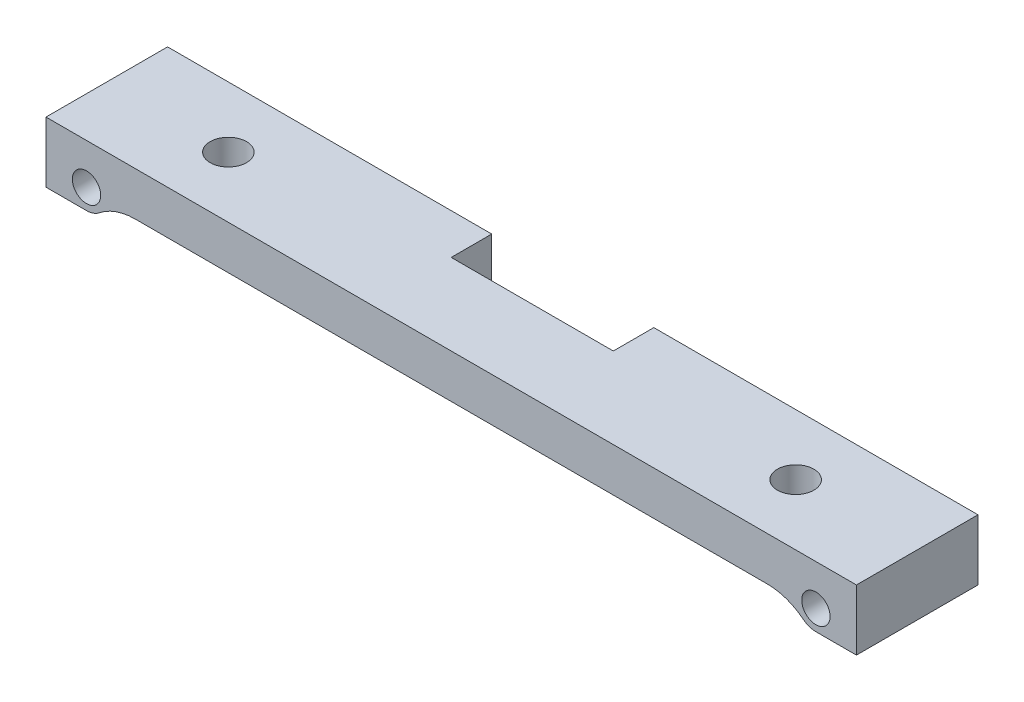
ISO-10303-21;
HEADER;
FILE_DESCRIPTION(('STEP AP214'),'2;1');
FILE_NAME('part.step','',(''),(''),'','','');
FILE_SCHEMA(('AUTOMOTIVE_DESIGN { 1 0 10303 214 1 1 1 1 }'));
ENDSEC;
DATA;
#1=APPLICATION_CONTEXT('core data for automotive mechanical design processes');
#2=APPLICATION_PROTOCOL_DEFINITION('international standard','automotive_design',2000,#1);
#3=PRODUCT_CONTEXT('',#1,'mechanical');
#4=PRODUCT('Part','Part','',(#3));
#5=PRODUCT_RELATED_PRODUCT_CATEGORY('part','',(#4));
#6=PRODUCT_DEFINITION_FORMATION('','',#4);
#7=PRODUCT_DEFINITION_CONTEXT('part definition',#1,'design');
#8=PRODUCT_DEFINITION('design','',#6,#7);
#9=PRODUCT_DEFINITION_SHAPE('','',#8);
#10=(LENGTH_UNIT() NAMED_UNIT(*) SI_UNIT(.MILLI.,.METRE.));
#11=(NAMED_UNIT(*) PLANE_ANGLE_UNIT() SI_UNIT($,.RADIAN.));
#12=(NAMED_UNIT(*) SI_UNIT($,.STERADIAN.) SOLID_ANGLE_UNIT());
#13=UNCERTAINTY_MEASURE_WITH_UNIT(LENGTH_MEASURE(1.E-05),#10,'distance_accuracy_value','');
#14=(GEOMETRIC_REPRESENTATION_CONTEXT(3) GLOBAL_UNCERTAINTY_ASSIGNED_CONTEXT((#13)) GLOBAL_UNIT_ASSIGNED_CONTEXT((#10,
#11,#12)) REPRESENTATION_CONTEXT('',''));
#15=CARTESIAN_POINT('',(0.,0.,0.));
#16=DIRECTION('',(0.,0.,1.));
#17=DIRECTION('',(1.,0.,0.));
#18=AXIS2_PLACEMENT_3D('',#15,#16,#17);
#19=CARTESIAN_POINT('',(45.,60.,0.));
#20=DIRECTION('',(0.,0.,-1.));
#21=DIRECTION('',(-1.,0.,0.));
#22=AXIS2_PLACEMENT_3D('',#19,#20,#21);
#23=PLANE('',#22);
#24=DIRECTION('',(0.,1.,0.));
#25=VECTOR('',#24,1.);
#26=CARTESIAN_POINT('',(10.,50.,0.));
#27=LINE('',#26,#25);
#28=CARTESIAN_POINT('',(10.,59.6046863561493,0.));
#29=VERTEX_POINT('',#28);
#30=CARTESIAN_POINT('',(10.,65.,0.));
#31=VERTEX_POINT('',#30);
#32=EDGE_CURVE('E245',#29,#31,#27,.T.);
#33=ORIENTED_EDGE('',*,*,#32,.T.);
#34=DIRECTION('',(-1.,0.,0.));
#35=VECTOR('',#34,1.);
#36=CARTESIAN_POINT('',(50.,65.,0.));
#37=LINE('',#36,#35);
#38=CARTESIAN_POINT('',(50.,65.,0.));
#39=VERTEX_POINT('',#38);
#40=EDGE_CURVE('E180',#39,#31,#37,.T.);
#41=ORIENTED_EDGE('',*,*,#40,.F.);
#42=DIRECTION('',(0.,1.,0.));
#43=VECTOR('',#42,1.);
#44=CARTESIAN_POINT('',(50.,57.5,0.));
#45=LINE('',#44,#43);
#46=CARTESIAN_POINT('',(50.,57.5,0.));
#47=VERTEX_POINT('',#46);
#48=EDGE_CURVE('E176',#47,#39,#45,.T.);
#49=ORIENTED_EDGE('',*,*,#48,.F.);
#50=DIRECTION('',(1.,0.,0.));
#51=VECTOR('',#50,1.);
#52=CARTESIAN_POINT('',(50.,57.5,0.));
#53=LINE('',#52,#51);
#54=CARTESIAN_POINT('',(45.,57.5,0.));
#55=VERTEX_POINT('',#54);
#56=EDGE_CURVE('E173',#55,#47,#53,.T.);
#57=ORIENTED_EDGE('',*,*,#56,.F.);
#58=CARTESIAN_POINT('',(45.,60.,0.));
#59=DIRECTION('',(0.,0.,1.));
#60=DIRECTION('',(-1.,0.,0.));
#61=AXIS2_PLACEMENT_3D('',#58,#59,#60);
#62=CIRCLE('',#61,2.5);
#63=CARTESIAN_POINT('',(43.438262381114,58.0478279763924,0.));
#64=VERTEX_POINT('',#63);
#65=EDGE_CURVE('E113',#64,#55,#62,.T.);
#66=ORIENTED_EDGE('',*,*,#65,.F.);
#67=CARTESIAN_POINT('',(39.,52.5,0.));
#68=DIRECTION('',(0.,0.,-1.));
#69=DIRECTION('',(1.,0.,0.));
#70=AXIS2_PLACEMENT_3D('',#67,#68,#69);
#71=CIRCLE('',#70,7.10468635614928);
#72=CARTESIAN_POINT('',(39.,59.6046863561493,0.));
#73=VERTEX_POINT('',#72);
#74=EDGE_CURVE('E194',#73,#64,#71,.T.);
#75=ORIENTED_EDGE('',*,*,#74,.F.);
#76=DIRECTION('',(1.,0.,0.));
#77=VECTOR('',#76,1.);
#78=CARTESIAN_POINT('',(39.,59.6046863561493,0.));
#79=LINE('',#78,#77);
#80=EDGE_CURVE('E161',#29,#73,#79,.T.);
#81=ORIENTED_EDGE('',*,*,#80,.F.);
#82=EDGE_LOOP('',(#33,#41,#49,#57,#66,#75,#81));
#83=FACE_BOUND('',#82,.T.);
#84=CARTESIAN_POINT('',(45.,60.,0.));
#85=DIRECTION('',(0.,0.,1.));
#86=DIRECTION('',(1.,0.,0.));
#87=AXIS2_PLACEMENT_3D('',#84,#85,#86);
#88=CIRCLE('',#87,1.75);
#89=CARTESIAN_POINT('',(46.75,60.,0.));
#90=VERTEX_POINT('',#89);
#91=EDGE_CURVE('E257',#90,#90,#88,.T.);
#92=ORIENTED_EDGE('',*,*,#91,.T.);
#93=EDGE_LOOP('',(#92));
#94=FACE_BOUND('',#93,.T.);
#95=ADVANCED_FACE('F48',(#83,#94),#23,.T.);
#96=CARTESIAN_POINT('',(45.,60.,15.));
#97=DIRECTION('',(0.,0.,-1.));
#98=DIRECTION('',(-1.,0.,0.));
#99=AXIS2_PLACEMENT_3D('',#96,#97,#98);
#100=PLANE('',#99);
#101=DIRECTION('',(1.,0.,0.));
#102=VECTOR('',#101,1.);
#103=CARTESIAN_POINT('',(50.,57.5,15.));
#104=LINE('',#103,#102);
#105=CARTESIAN_POINT('',(45.,57.5,15.));
#106=VERTEX_POINT('',#105);
#107=CARTESIAN_POINT('',(50.,57.5,15.));
#108=VERTEX_POINT('',#107);
#109=EDGE_CURVE('E197',#106,#108,#104,.T.);
#110=ORIENTED_EDGE('',*,*,#109,.T.);
#111=DIRECTION('',(0.,1.,0.));
#112=VECTOR('',#111,1.);
#113=CARTESIAN_POINT('',(50.,57.5,15.));
#114=LINE('',#113,#112);
#115=CARTESIAN_POINT('',(50.,65.,15.));
#116=VERTEX_POINT('',#115);
#117=EDGE_CURVE('E122',#108,#116,#114,.T.);
#118=ORIENTED_EDGE('',*,*,#117,.T.);
#119=DIRECTION('',(-1.,0.,0.));
#120=VECTOR('',#119,1.);
#121=CARTESIAN_POINT('',(50.,65.,15.));
#122=LINE('',#121,#120);
#123=CARTESIAN_POINT('',(-50.,65.,15.));
#124=VERTEX_POINT('',#123);
#125=EDGE_CURVE('E266',#116,#124,#122,.T.);
#126=ORIENTED_EDGE('',*,*,#125,.T.);
#127=DIRECTION('',(0.,-1.,0.));
#128=VECTOR('',#127,1.);
#129=CARTESIAN_POINT('',(-50.,57.5,15.));
#130=LINE('',#129,#128);
#131=CARTESIAN_POINT('',(-50.,57.5,15.));
#132=VERTEX_POINT('',#131);
#133=EDGE_CURVE('E268',#124,#132,#130,.T.);
#134=ORIENTED_EDGE('',*,*,#133,.T.);
#135=DIRECTION('',(1.,0.,0.));
#136=VECTOR('',#135,1.);
#137=CARTESIAN_POINT('',(-50.,57.5,15.));
#138=LINE('',#137,#136);
#139=CARTESIAN_POINT('',(-45.,57.5,15.));
#140=VERTEX_POINT('',#139);
#141=EDGE_CURVE('E270',#132,#140,#138,.T.);
#142=ORIENTED_EDGE('',*,*,#141,.T.);
#143=CARTESIAN_POINT('',(-45.,60.,15.));
#144=DIRECTION('',(0.,0.,1.));
#145=DIRECTION('',(1.,0.,0.));
#146=AXIS2_PLACEMENT_3D('',#143,#144,#145);
#147=CIRCLE('',#146,2.5);
#148=CARTESIAN_POINT('',(-43.438262381114,58.0478279763924,15.));
#149=VERTEX_POINT('',#148);
#150=EDGE_CURVE('E272',#140,#149,#147,.T.);
#151=ORIENTED_EDGE('',*,*,#150,.T.);
#152=CARTESIAN_POINT('',(-39.,52.5,15.));
#153=DIRECTION('',(0.,0.,-1.));
#154=DIRECTION('',(-1.,0.,0.));
#155=AXIS2_PLACEMENT_3D('',#152,#153,#154);
#156=CIRCLE('',#155,7.10468635614928);
#157=CARTESIAN_POINT('',(-39.,59.6046863561493,15.));
#158=VERTEX_POINT('',#157);
#159=EDGE_CURVE('E151',#149,#158,#156,.T.);
#160=ORIENTED_EDGE('',*,*,#159,.T.);
#161=DIRECTION('',(1.,0.,0.));
#162=VECTOR('',#161,1.);
#163=CARTESIAN_POINT('',(39.,59.6046863561493,15.));
#164=LINE('',#163,#162);
#165=CARTESIAN_POINT('',(39.,59.6046863561493,15.));
#166=VERTEX_POINT('',#165);
#167=EDGE_CURVE('E143',#158,#166,#164,.T.);
#168=ORIENTED_EDGE('',*,*,#167,.T.);
#169=CARTESIAN_POINT('',(39.,52.5,15.));
#170=DIRECTION('',(0.,0.,-1.));
#171=DIRECTION('',(1.,0.,0.));
#172=AXIS2_PLACEMENT_3D('',#169,#170,#171);
#173=CIRCLE('',#172,7.10468635614928);
#174=CARTESIAN_POINT('',(43.438262381114,58.0478279763924,15.));
#175=VERTEX_POINT('',#174);
#176=EDGE_CURVE('E148',#166,#175,#173,.T.);
#177=ORIENTED_EDGE('',*,*,#176,.T.);
#178=CARTESIAN_POINT('',(45.,60.,15.));
#179=DIRECTION('',(0.,0.,1.));
#180=DIRECTION('',(-1.,0.,0.));
#181=AXIS2_PLACEMENT_3D('',#178,#179,#180);
#182=CIRCLE('',#181,2.5);
#183=EDGE_CURVE('E74',#175,#106,#182,.T.);
#184=ORIENTED_EDGE('',*,*,#183,.T.);
#185=EDGE_LOOP('',(#110,#118,#126,#134,#142,#151,#160,#168,#177,#184));
#186=FACE_BOUND('',#185,.T.);
#187=CARTESIAN_POINT('',(45.,60.,15.));
#188=DIRECTION('',(0.,0.,1.));
#189=DIRECTION('',(1.,0.,0.));
#190=AXIS2_PLACEMENT_3D('',#187,#188,#189);
#191=CIRCLE('',#190,1.75);
#192=CARTESIAN_POINT('',(46.75,60.,15.));
#193=VERTEX_POINT('',#192);
#194=EDGE_CURVE('E177',#193,#193,#191,.T.);
#195=ORIENTED_EDGE('',*,*,#194,.F.);
#196=EDGE_LOOP('',(#195));
#197=FACE_BOUND('',#196,.T.);
#198=CARTESIAN_POINT('',(-45.,60.,15.));
#199=DIRECTION('',(0.,0.,1.));
#200=DIRECTION('',(-1.,0.,0.));
#201=AXIS2_PLACEMENT_3D('',#198,#199,#200);
#202=CIRCLE('',#201,1.75);
#203=CARTESIAN_POINT('',(-46.75,60.,15.));
#204=VERTEX_POINT('',#203);
#205=EDGE_CURVE('E254',#204,#204,#202,.T.);
#206=ORIENTED_EDGE('',*,*,#205,.F.);
#207=EDGE_LOOP('',(#206));
#208=FACE_BOUND('',#207,.T.);
#209=ADVANCED_FACE('F145',(#186,#197,#208),#100,.F.);
#210=DIRECTION('',(0.,1.,0.));
#211=VECTOR('',#210,1.);
#212=CARTESIAN_POINT('',(-10.,50.,0.));
#213=LINE('',#212,#211);
#214=CARTESIAN_POINT('',(-10.,59.6046863561493,0.));
#215=VERTEX_POINT('',#214);
#216=CARTESIAN_POINT('',(-10.,65.,0.));
#217=VERTEX_POINT('',#216);
#218=EDGE_CURVE('E249',#215,#217,#213,.T.);
#219=ORIENTED_EDGE('',*,*,#218,.F.);
#220=CARTESIAN_POINT('',(-39.,59.6046863561493,0.));
#221=VERTEX_POINT('',#220);
#222=EDGE_CURVE('E191',#221,#215,#79,.T.);
#223=ORIENTED_EDGE('',*,*,#222,.F.);
#224=CARTESIAN_POINT('',(-39.,52.5,0.));
#225=DIRECTION('',(0.,0.,-1.));
#226=DIRECTION('',(-1.,0.,0.));
#227=AXIS2_PLACEMENT_3D('',#224,#225,#226);
#228=CIRCLE('',#227,7.10468635614928);
#229=CARTESIAN_POINT('',(-43.438262381114,58.0478279763924,0.));
#230=VERTEX_POINT('',#229);
#231=EDGE_CURVE('E189',#230,#221,#228,.T.);
#232=ORIENTED_EDGE('',*,*,#231,.F.);
#233=CARTESIAN_POINT('',(-45.,60.,0.));
#234=DIRECTION('',(0.,0.,1.));
#235=DIRECTION('',(1.,0.,0.));
#236=AXIS2_PLACEMENT_3D('',#233,#234,#235);
#237=CIRCLE('',#236,2.5);
#238=CARTESIAN_POINT('',(-45.,57.5,0.));
#239=VERTEX_POINT('',#238);
#240=EDGE_CURVE('E187',#239,#230,#237,.T.);
#241=ORIENTED_EDGE('',*,*,#240,.F.);
#242=DIRECTION('',(1.,0.,0.));
#243=VECTOR('',#242,1.);
#244=CARTESIAN_POINT('',(-50.,57.5,0.));
#245=LINE('',#244,#243);
#246=CARTESIAN_POINT('',(-50.,57.5,0.));
#247=VERTEX_POINT('',#246);
#248=EDGE_CURVE('E185',#247,#239,#245,.T.);
#249=ORIENTED_EDGE('',*,*,#248,.F.);
#250=DIRECTION('',(0.,-1.,0.));
#251=VECTOR('',#250,1.);
#252=CARTESIAN_POINT('',(-50.,57.5,0.));
#253=LINE('',#252,#251);
#254=CARTESIAN_POINT('',(-50.,65.,0.));
#255=VERTEX_POINT('',#254);
#256=EDGE_CURVE('E183',#255,#247,#253,.T.);
#257=ORIENTED_EDGE('',*,*,#256,.F.);
#258=EDGE_CURVE('E179',#217,#255,#37,.T.);
#259=ORIENTED_EDGE('',*,*,#258,.F.);
#260=EDGE_LOOP('',(#219,#223,#232,#241,#249,#257,#259));
#261=FACE_BOUND('',#260,.T.);
#262=CARTESIAN_POINT('',(-45.,60.,0.));
#263=DIRECTION('',(0.,0.,1.));
#264=DIRECTION('',(-1.,0.,0.));
#265=AXIS2_PLACEMENT_3D('',#262,#263,#264);
#266=CIRCLE('',#265,1.75);
#267=CARTESIAN_POINT('',(-46.75,60.,0.));
#268=VERTEX_POINT('',#267);
#269=EDGE_CURVE('E227',#268,#268,#266,.T.);
#270=ORIENTED_EDGE('',*,*,#269,.T.);
#271=EDGE_LOOP('',(#270));
#272=FACE_BOUND('',#271,.T.);
#273=ADVANCED_FACE('F287',(#261,#272),#23,.T.);
#274=CARTESIAN_POINT('',(50.,57.5,15.));
#275=DIRECTION('',(0.,1.,0.));
#276=DIRECTION('',(0.,0.,1.));
#277=AXIS2_PLACEMENT_3D('',#274,#275,#276);
#278=PLANE('',#277);
#279=ORIENTED_EDGE('',*,*,#56,.T.);
#280=DIRECTION('',(0.,0.,-1.));
#281=VECTOR('',#280,1.);
#282=CARTESIAN_POINT('',(50.,57.5,15.));
#283=LINE('',#282,#281);
#284=EDGE_CURVE('E216',#108,#47,#283,.T.);
#285=ORIENTED_EDGE('',*,*,#284,.F.);
#286=ORIENTED_EDGE('',*,*,#109,.F.);
#287=DIRECTION('',(0.,0.,-1.));
#288=VECTOR('',#287,1.);
#289=CARTESIAN_POINT('',(45.,57.5,15.));
#290=LINE('',#289,#288);
#291=EDGE_CURVE('E169',#106,#55,#290,.T.);
#292=ORIENTED_EDGE('',*,*,#291,.T.);
#293=EDGE_LOOP('',(#279,#285,#286,#292));
#294=FACE_BOUND('',#293,.T.);
#295=ADVANCED_FACE('F50',(#294),#278,.F.);
#296=CARTESIAN_POINT('',(50.,57.5,15.));
#297=DIRECTION('',(-1.,0.,0.));
#298=DIRECTION('',(0.,0.,1.));
#299=AXIS2_PLACEMENT_3D('',#296,#297,#298);
#300=PLANE('',#299);
#301=ORIENTED_EDGE('',*,*,#48,.T.);
#302=DIRECTION('',(0.,0.,-1.));
#303=VECTOR('',#302,1.);
#304=CARTESIAN_POINT('',(50.,65.,15.));
#305=LINE('',#304,#303);
#306=EDGE_CURVE('E213',#116,#39,#305,.T.);
#307=ORIENTED_EDGE('',*,*,#306,.F.);
#308=ORIENTED_EDGE('',*,*,#117,.F.);
#309=ORIENTED_EDGE('',*,*,#284,.T.);
#310=EDGE_LOOP('',(#301,#307,#308,#309));
#311=FACE_BOUND('',#310,.T.);
#312=ADVANCED_FACE('F319',(#311),#300,.F.);
#313=CARTESIAN_POINT('',(50.,65.,15.));
#314=DIRECTION('',(0.,-1.,0.));
#315=DIRECTION('',(0.,0.,-1.));
#316=AXIS2_PLACEMENT_3D('',#313,#314,#315);
#317=PLANE('',#316);
#318=CARTESIAN_POINT('',(35.,65.,7.5));
#319=DIRECTION('',(0.,1.,0.));
#320=DIRECTION('',(0.,0.,1.));
#321=AXIS2_PLACEMENT_3D('',#318,#319,#320);
#322=CIRCLE('',#321,2.25);
#323=CARTESIAN_POINT('',(35.,65.,9.75));
#324=VERTEX_POINT('',#323);
#325=EDGE_CURVE('E223',#324,#324,#322,.T.);
#326=ORIENTED_EDGE('',*,*,#325,.F.);
#327=EDGE_LOOP('',(#326));
#328=FACE_BOUND('',#327,.T.);
#329=CARTESIAN_POINT('',(-35.,65.,7.5));
#330=DIRECTION('',(0.,1.,0.));
#331=DIRECTION('',(0.,0.,-1.));
#332=AXIS2_PLACEMENT_3D('',#329,#330,#331);
#333=CIRCLE('',#332,2.25);
#334=CARTESIAN_POINT('',(-35.,65.,5.25));
#335=VERTEX_POINT('',#334);
#336=EDGE_CURVE('E229',#335,#335,#333,.T.);
#337=ORIENTED_EDGE('',*,*,#336,.F.);
#338=EDGE_LOOP('',(#337));
#339=FACE_BOUND('',#338,.T.);
#340=ORIENTED_EDGE('',*,*,#40,.T.);
#341=DIRECTION('',(0.,0.,-1.));
#342=VECTOR('',#341,1.);
#343=CARTESIAN_POINT('',(10.,65.,0.));
#344=LINE('',#343,#342);
#345=CARTESIAN_POINT('',(10.,65.,5.));
#346=VERTEX_POINT('',#345);
#347=EDGE_CURVE('E237',#346,#31,#344,.T.);
#348=ORIENTED_EDGE('',*,*,#347,.F.);
#349=DIRECTION('',(1.,0.,0.));
#350=VECTOR('',#349,1.);
#351=CARTESIAN_POINT('',(10.,65.,5.));
#352=LINE('',#351,#350);
#353=CARTESIAN_POINT('',(-10.,65.,5.));
#354=VERTEX_POINT('',#353);
#355=EDGE_CURVE('E242',#354,#346,#352,.T.);
#356=ORIENTED_EDGE('',*,*,#355,.F.);
#357=DIRECTION('',(0.,0.,1.));
#358=VECTOR('',#357,1.);
#359=CARTESIAN_POINT('',(-10.,65.,0.));
#360=LINE('',#359,#358);
#361=EDGE_CURVE('E240',#217,#354,#360,.T.);
#362=ORIENTED_EDGE('',*,*,#361,.F.);
#363=ORIENTED_EDGE('',*,*,#258,.T.);
#364=DIRECTION('',(0.,0.,-1.));
#365=VECTOR('',#364,1.);
#366=CARTESIAN_POINT('',(-50.,65.,15.));
#367=LINE('',#366,#365);
#368=EDGE_CURVE('E210',#124,#255,#367,.T.);
#369=ORIENTED_EDGE('',*,*,#368,.F.);
#370=ORIENTED_EDGE('',*,*,#125,.F.);
#371=ORIENTED_EDGE('',*,*,#306,.T.);
#372=EDGE_LOOP('',(#340,#348,#356,#362,#363,#369,#370,#371));
#373=FACE_BOUND('',#372,.T.);
#374=ADVANCED_FACE('F300',(#328,#339,#373),#317,.F.);
#375=CARTESIAN_POINT('',(-50.,57.5,15.));
#376=DIRECTION('',(1.,0.,0.));
#377=DIRECTION('',(0.,0.,-1.));
#378=AXIS2_PLACEMENT_3D('',#375,#376,#377);
#379=PLANE('',#378);
#380=ORIENTED_EDGE('',*,*,#256,.T.);
#381=DIRECTION('',(0.,0.,-1.));
#382=VECTOR('',#381,1.);
#383=CARTESIAN_POINT('',(-50.,57.5,15.));
#384=LINE('',#383,#382);
#385=EDGE_CURVE('E207',#132,#247,#384,.T.);
#386=ORIENTED_EDGE('',*,*,#385,.F.);
#387=ORIENTED_EDGE('',*,*,#133,.F.);
#388=ORIENTED_EDGE('',*,*,#368,.T.);
#389=EDGE_LOOP('',(#380,#386,#387,#388));
#390=FACE_BOUND('',#389,.T.);
#391=ADVANCED_FACE('F352',(#390),#379,.F.);
#392=CARTESIAN_POINT('',(-50.,57.5,15.));
#393=DIRECTION('',(0.,1.,0.));
#394=DIRECTION('',(0.,0.,1.));
#395=AXIS2_PLACEMENT_3D('',#392,#393,#394);
#396=PLANE('',#395);
#397=ORIENTED_EDGE('',*,*,#248,.T.);
#398=DIRECTION('',(0.,0.,-1.));
#399=VECTOR('',#398,1.);
#400=CARTESIAN_POINT('',(-45.,57.5,15.));
#401=LINE('',#400,#399);
#402=EDGE_CURVE('E204',#140,#239,#401,.T.);
#403=ORIENTED_EDGE('',*,*,#402,.F.);
#404=ORIENTED_EDGE('',*,*,#141,.F.);
#405=ORIENTED_EDGE('',*,*,#385,.T.);
#406=EDGE_LOOP('',(#397,#403,#404,#405));
#407=FACE_BOUND('',#406,.T.);
#408=ADVANCED_FACE('F358',(#407),#396,.F.);
#409=CARTESIAN_POINT('',(-45.,60.,15.));
#410=DIRECTION('',(0.,0.,-1.));
#411=DIRECTION('',(-1.,0.,0.));
#412=AXIS2_PLACEMENT_3D('',#409,#410,#411);
#413=CYLINDRICAL_SURFACE('',#412,2.5);
#414=ORIENTED_EDGE('',*,*,#240,.T.);
#415=DIRECTION('',(0.,0.,-1.));
#416=VECTOR('',#415,1.);
#417=CARTESIAN_POINT('',(-43.438262381114,58.0478279763924,15.));
#418=LINE('',#417,#416);
#419=EDGE_CURVE('E201',#149,#230,#418,.T.);
#420=ORIENTED_EDGE('',*,*,#419,.F.);
#421=ORIENTED_EDGE('',*,*,#150,.F.);
#422=ORIENTED_EDGE('',*,*,#402,.T.);
#423=EDGE_LOOP('',(#414,#420,#421,#422));
#424=FACE_BOUND('',#423,.T.);
#425=ADVANCED_FACE('F278',(#424),#413,.T.);
#426=CARTESIAN_POINT('',(-39.,52.5,15.));
#427=DIRECTION('',(0.,0.,-1.));
#428=DIRECTION('',(-1.,0.,0.));
#429=AXIS2_PLACEMENT_3D('',#426,#427,#428);
#430=CYLINDRICAL_SURFACE('',#429,7.10468635614928);
#431=ORIENTED_EDGE('',*,*,#231,.T.);
#432=DIRECTION('',(0.,0.,-1.));
#433=VECTOR('',#432,1.);
#434=CARTESIAN_POINT('',(-39.,59.6046863561493,15.));
#435=LINE('',#434,#433);
#436=EDGE_CURVE('E164',#158,#221,#435,.T.);
#437=ORIENTED_EDGE('',*,*,#436,.F.);
#438=ORIENTED_EDGE('',*,*,#159,.F.);
#439=ORIENTED_EDGE('',*,*,#419,.T.);
#440=EDGE_LOOP('',(#431,#437,#438,#439));
#441=FACE_BOUND('',#440,.T.);
#442=ADVANCED_FACE('F282',(#441),#430,.F.);
#443=CARTESIAN_POINT('',(39.,59.6046863561493,15.));
#444=DIRECTION('',(0.,1.,0.));
#445=DIRECTION('',(0.,0.,1.));
#446=AXIS2_PLACEMENT_3D('',#443,#444,#445);
#447=PLANE('',#446);
#448=CARTESIAN_POINT('',(35.,59.6046863561493,7.5));
#449=DIRECTION('',(0.,1.,0.));
#450=DIRECTION('',(0.,0.,1.));
#451=AXIS2_PLACEMENT_3D('',#448,#449,#450);
#452=CIRCLE('',#451,2.25);
#453=CARTESIAN_POINT('',(35.,59.6046863561493,9.75));
#454=VERTEX_POINT('',#453);
#455=EDGE_CURVE('E52',#454,#454,#452,.T.);
#456=ORIENTED_EDGE('',*,*,#455,.T.);
#457=EDGE_LOOP('',(#456));
#458=FACE_BOUND('',#457,.T.);
#459=CARTESIAN_POINT('',(-35.,59.6046863561493,7.5));
#460=DIRECTION('',(0.,1.,0.));
#461=DIRECTION('',(0.,0.,1.));
#462=AXIS2_PLACEMENT_3D('',#459,#460,#461);
#463=CIRCLE('',#462,2.25);
#464=CARTESIAN_POINT('',(-35.,59.6046863561493,9.75));
#465=VERTEX_POINT('',#464);
#466=EDGE_CURVE('E221',#465,#465,#463,.T.);
#467=ORIENTED_EDGE('',*,*,#466,.T.);
#468=EDGE_LOOP('',(#467));
#469=FACE_BOUND('',#468,.T.);
#470=DIRECTION('',(1.,0.,0.));
#471=VECTOR('',#470,1.);
#472=CARTESIAN_POINT('',(39.,59.6046863561493,5.));
#473=LINE('',#472,#471);
#474=CARTESIAN_POINT('',(-10.,59.6046863561493,5.));
#475=VERTEX_POINT('',#474);
#476=CARTESIAN_POINT('',(10.,59.6046863561493,5.));
#477=VERTEX_POINT('',#476);
#478=EDGE_CURVE('E57',#475,#477,#473,.T.);
#479=ORIENTED_EDGE('',*,*,#478,.T.);
#480=DIRECTION('',(0.,0.,-1.));
#481=VECTOR('',#480,1.);
#482=CARTESIAN_POINT('',(10.,59.6046863561493,15.));
#483=LINE('',#482,#481);
#484=EDGE_CURVE('E13',#477,#29,#483,.T.);
#485=ORIENTED_EDGE('',*,*,#484,.T.);
#486=ORIENTED_EDGE('',*,*,#80,.T.);
#487=DIRECTION('',(0.,0.,-1.));
#488=VECTOR('',#487,1.);
#489=CARTESIAN_POINT('',(39.,59.6046863561493,15.));
#490=LINE('',#489,#488);
#491=EDGE_CURVE('E157',#166,#73,#490,.T.);
#492=ORIENTED_EDGE('',*,*,#491,.F.);
#493=ORIENTED_EDGE('',*,*,#167,.F.);
#494=ORIENTED_EDGE('',*,*,#436,.T.);
#495=ORIENTED_EDGE('',*,*,#222,.T.);
#496=DIRECTION('',(0.,0.,1.));
#497=VECTOR('',#496,1.);
#498=CARTESIAN_POINT('',(-10.,59.6046863561493,15.));
#499=LINE('',#498,#497);
#500=EDGE_CURVE('E218',#215,#475,#499,.T.);
#501=ORIENTED_EDGE('',*,*,#500,.T.);
#502=EDGE_LOOP('',(#479,#485,#486,#492,#493,#494,#495,#501));
#503=FACE_BOUND('',#502,.T.);
#504=ADVANCED_FACE('F159',(#458,#469,#503),#447,.F.);
#505=CARTESIAN_POINT('',(39.,52.5,15.));
#506=DIRECTION('',(0.,0.,-1.));
#507=DIRECTION('',(-1.,0.,0.));
#508=AXIS2_PLACEMENT_3D('',#505,#506,#507);
#509=CYLINDRICAL_SURFACE('',#508,7.10468635614928);
#510=ORIENTED_EDGE('',*,*,#74,.T.);
#511=DIRECTION('',(0.,0.,-1.));
#512=VECTOR('',#511,1.);
#513=CARTESIAN_POINT('',(43.438262381114,58.0478279763924,15.));
#514=LINE('',#513,#512);
#515=EDGE_CURVE('E165',#175,#64,#514,.T.);
#516=ORIENTED_EDGE('',*,*,#515,.F.);
#517=ORIENTED_EDGE('',*,*,#176,.F.);
#518=ORIENTED_EDGE('',*,*,#491,.T.);
#519=EDGE_LOOP('',(#510,#516,#517,#518));
#520=FACE_BOUND('',#519,.T.);
#521=ADVANCED_FACE('F167',(#520),#509,.F.);
#522=CARTESIAN_POINT('',(45.,60.,15.));
#523=DIRECTION('',(0.,0.,-1.));
#524=DIRECTION('',(-1.,0.,0.));
#525=AXIS2_PLACEMENT_3D('',#522,#523,#524);
#526=CYLINDRICAL_SURFACE('',#525,2.5);
#527=ORIENTED_EDGE('',*,*,#65,.T.);
#528=ORIENTED_EDGE('',*,*,#291,.F.);
#529=ORIENTED_EDGE('',*,*,#183,.F.);
#530=ORIENTED_EDGE('',*,*,#515,.T.);
#531=EDGE_LOOP('',(#527,#528,#529,#530));
#532=FACE_BOUND('',#531,.T.);
#533=ADVANCED_FACE('F324',(#532),#526,.T.);
#534=CARTESIAN_POINT('',(45.,60.,15.));
#535=DIRECTION('',(0.,0.,-1.));
#536=DIRECTION('',(-1.,0.,0.));
#537=AXIS2_PLACEMENT_3D('',#534,#535,#536);
#538=CYLINDRICAL_SURFACE('',#537,1.75);
#539=ORIENTED_EDGE('',*,*,#194,.T.);
#540=EDGE_LOOP('',(#539));
#541=FACE_BOUND('',#540,.T.);
#542=ORIENTED_EDGE('',*,*,#91,.F.);
#543=EDGE_LOOP('',(#542));
#544=FACE_BOUND('',#543,.T.);
#545=ADVANCED_FACE('F326',(#541,#544),#538,.F.);
#546=CARTESIAN_POINT('',(-45.,60.,15.));
#547=DIRECTION('',(0.,0.,-1.));
#548=DIRECTION('',(-1.,0.,0.));
#549=AXIS2_PLACEMENT_3D('',#546,#547,#548);
#550=CYLINDRICAL_SURFACE('',#549,1.75);
#551=ORIENTED_EDGE('',*,*,#205,.T.);
#552=EDGE_LOOP('',(#551));
#553=FACE_BOUND('',#552,.T.);
#554=ORIENTED_EDGE('',*,*,#269,.F.);
#555=EDGE_LOOP('',(#554));
#556=FACE_BOUND('',#555,.T.);
#557=ADVANCED_FACE('F332',(#553,#556),#550,.F.);
#558=CARTESIAN_POINT('',(10.,50.,0.));
#559=DIRECTION('',(1.,0.,0.));
#560=DIRECTION('',(0.,0.,-1.));
#561=AXIS2_PLACEMENT_3D('',#558,#559,#560);
#562=PLANE('',#561);
#563=DIRECTION('',(0.,1.,0.));
#564=VECTOR('',#563,1.);
#565=CARTESIAN_POINT('',(10.,50.,5.));
#566=LINE('',#565,#564);
#567=EDGE_CURVE('E234',#477,#346,#566,.T.);
#568=ORIENTED_EDGE('',*,*,#567,.T.);
#569=ORIENTED_EDGE('',*,*,#347,.T.);
#570=ORIENTED_EDGE('',*,*,#32,.F.);
#571=ORIENTED_EDGE('',*,*,#484,.F.);
#572=EDGE_LOOP('',(#568,#569,#570,#571));
#573=FACE_BOUND('',#572,.T.);
#574=ADVANCED_FACE('F314',(#573),#562,.F.);
#575=CARTESIAN_POINT('',(10.,50.,5.));
#576=DIRECTION('',(0.,0.,1.));
#577=DIRECTION('',(1.,0.,0.));
#578=AXIS2_PLACEMENT_3D('',#575,#576,#577);
#579=PLANE('',#578);
#580=DIRECTION('',(0.,1.,0.));
#581=VECTOR('',#580,1.);
#582=CARTESIAN_POINT('',(-10.,50.,5.));
#583=LINE('',#582,#581);
#584=EDGE_CURVE('E65',#475,#354,#583,.T.);
#585=ORIENTED_EDGE('',*,*,#584,.T.);
#586=ORIENTED_EDGE('',*,*,#355,.T.);
#587=ORIENTED_EDGE('',*,*,#567,.F.);
#588=ORIENTED_EDGE('',*,*,#478,.F.);
#589=EDGE_LOOP('',(#585,#586,#587,#588));
#590=FACE_BOUND('',#589,.T.);
#591=ADVANCED_FACE('F307',(#590),#579,.F.);
#592=CARTESIAN_POINT('',(-10.,50.,0.));
#593=DIRECTION('',(-1.,0.,0.));
#594=DIRECTION('',(0.,0.,1.));
#595=AXIS2_PLACEMENT_3D('',#592,#593,#594);
#596=PLANE('',#595);
#597=ORIENTED_EDGE('',*,*,#218,.T.);
#598=ORIENTED_EDGE('',*,*,#361,.T.);
#599=ORIENTED_EDGE('',*,*,#584,.F.);
#600=ORIENTED_EDGE('',*,*,#500,.F.);
#601=EDGE_LOOP('',(#597,#598,#599,#600));
#602=FACE_BOUND('',#601,.T.);
#603=ADVANCED_FACE('F294',(#602),#596,.F.);
#604=CARTESIAN_POINT('',(-35.,50.,7.5));
#605=DIRECTION('',(0.,1.,0.));
#606=DIRECTION('',(0.,0.,1.));
#607=AXIS2_PLACEMENT_3D('',#604,#605,#606);
#608=CYLINDRICAL_SURFACE('',#607,2.25);
#609=ORIENTED_EDGE('',*,*,#336,.T.);
#610=EDGE_LOOP('',(#609));
#611=FACE_BOUND('',#610,.T.);
#612=ORIENTED_EDGE('',*,*,#466,.F.);
#613=EDGE_LOOP('',(#612));
#614=FACE_BOUND('',#613,.T.);
#615=ADVANCED_FACE('F375',(#611,#614),#608,.F.);
#616=CARTESIAN_POINT('',(35.,50.,7.5));
#617=DIRECTION('',(0.,1.,0.));
#618=DIRECTION('',(0.,0.,1.));
#619=AXIS2_PLACEMENT_3D('',#616,#617,#618);
#620=CYLINDRICAL_SURFACE('',#619,2.25);
#621=ORIENTED_EDGE('',*,*,#325,.T.);
#622=EDGE_LOOP('',(#621));
#623=FACE_BOUND('',#622,.T.);
#624=ORIENTED_EDGE('',*,*,#455,.F.);
#625=EDGE_LOOP('',(#624));
#626=FACE_BOUND('',#625,.T.);
#627=ADVANCED_FACE('F373',(#623,#626),#620,.F.);
#628=CLOSED_SHELL('',(#95,#209,#273,#295,#312,#374,#391,#408,#425,#442,#504,#521,#533,#545,#557,
#574,#591,#603,#615,#627));
#629=MANIFOLD_SOLID_BREP('B2',#628);
#630=ADVANCED_BREP_SHAPE_REPRESENTATION('',(#18,#629),#14);
#631=SHAPE_DEFINITION_REPRESENTATION(#9,#630);
ENDSEC;
END-ISO-10303-21;
